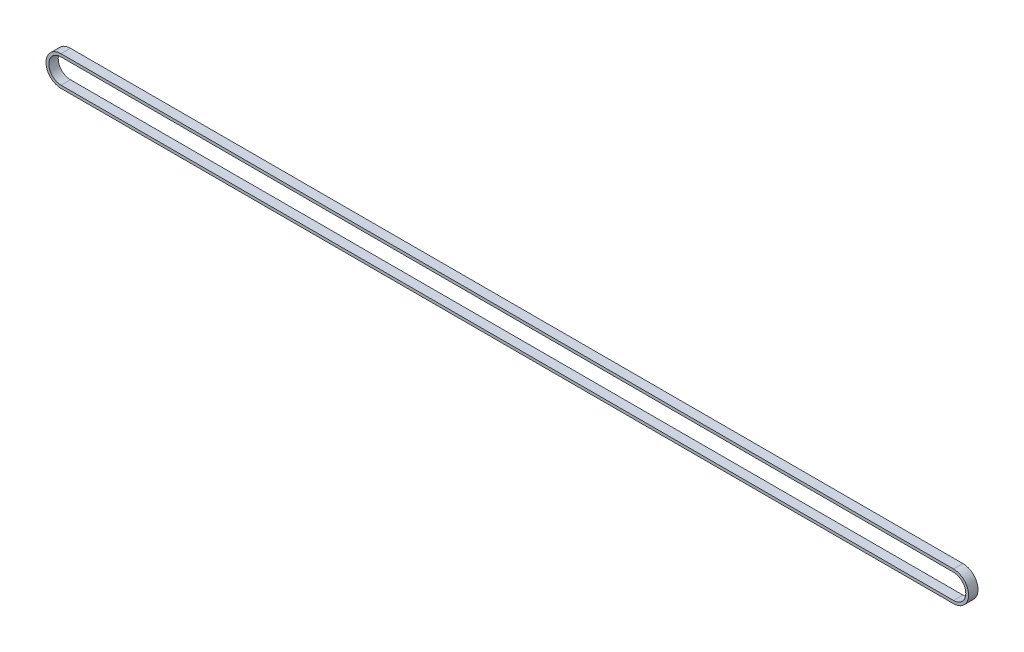
ISO-10303-21;
HEADER;
FILE_DESCRIPTION(('STEP AP214'),'2;1');
FILE_NAME('part.step','',(''),(''),'','','');
FILE_SCHEMA(('AUTOMOTIVE_DESIGN { 1 0 10303 214 1 1 1 1 }'));
ENDSEC;
DATA;
#1=APPLICATION_CONTEXT('core data for automotive mechanical design processes');
#2=APPLICATION_PROTOCOL_DEFINITION('international standard','automotive_design',2000,#1);
#3=PRODUCT_CONTEXT('',#1,'mechanical');
#4=PRODUCT('Part','Part','',(#3));
#5=PRODUCT_RELATED_PRODUCT_CATEGORY('part','',(#4));
#6=PRODUCT_DEFINITION_FORMATION('','',#4);
#7=PRODUCT_DEFINITION_CONTEXT('part definition',#1,'design');
#8=PRODUCT_DEFINITION('design','',#6,#7);
#9=PRODUCT_DEFINITION_SHAPE('','',#8);
#10=(LENGTH_UNIT() NAMED_UNIT(*) SI_UNIT(.MILLI.,.METRE.));
#11=(NAMED_UNIT(*) PLANE_ANGLE_UNIT() SI_UNIT($,.RADIAN.));
#12=(NAMED_UNIT(*) SI_UNIT($,.STERADIAN.) SOLID_ANGLE_UNIT());
#13=UNCERTAINTY_MEASURE_WITH_UNIT(LENGTH_MEASURE(1.E-05),#10,'distance_accuracy_value','');
#14=(GEOMETRIC_REPRESENTATION_CONTEXT(3) GLOBAL_UNCERTAINTY_ASSIGNED_CONTEXT((#13)) GLOBAL_UNIT_ASSIGNED_CONTEXT((#10,
#11,#12)) REPRESENTATION_CONTEXT('',''));
#15=CARTESIAN_POINT('',(0.,0.,0.));
#16=DIRECTION('',(0.,0.,1.));
#17=DIRECTION('',(1.,0.,0.));
#18=AXIS2_PLACEMENT_3D('',#15,#16,#17);
#19=CARTESIAN_POINT('',(0.,0.,5.));
#20=DIRECTION('',(0.,0.,1.));
#21=DIRECTION('',(1.,0.,0.));
#22=AXIS2_PLACEMENT_3D('',#19,#20,#21);
#23=PLANE('',#22);
#24=CARTESIAN_POINT('',(0.,0.,5.));
#25=DIRECTION('',(0.,0.,1.));
#26=DIRECTION('',(1.,0.,0.));
#27=AXIS2_PLACEMENT_3D('',#24,#25,#26);
#28=CIRCLE('',#27,8.);
#29=CARTESIAN_POINT('',(0.,8.,5.));
#30=VERTEX_POINT('',#29);
#31=CARTESIAN_POINT('',(0.,-8.,5.));
#32=VERTEX_POINT('',#31);
#33=EDGE_CURVE('E133',#30,#32,#28,.T.);
#34=ORIENTED_EDGE('',*,*,#33,.T.);
#35=DIRECTION('',(1.,0.,0.));
#36=VECTOR('',#35,1.);
#37=CARTESIAN_POINT('',(0.,-8.,5.));
#38=LINE('',#37,#36);
#39=CARTESIAN_POINT('',(474.5,-8.,5.));
#40=VERTEX_POINT('',#39);
#41=EDGE_CURVE('E136',#32,#40,#38,.T.);
#42=ORIENTED_EDGE('',*,*,#41,.T.);
#43=CARTESIAN_POINT('',(474.5,0.,5.));
#44=DIRECTION('',(0.,0.,1.));
#45=DIRECTION('',(1.,0.,0.));
#46=AXIS2_PLACEMENT_3D('',#43,#44,#45);
#47=CIRCLE('',#46,8.);
#48=CARTESIAN_POINT('',(474.5,8.,5.));
#49=VERTEX_POINT('',#48);
#50=EDGE_CURVE('E139',#40,#49,#47,.T.);
#51=ORIENTED_EDGE('',*,*,#50,.T.);
#52=DIRECTION('',(-1.,0.,0.));
#53=VECTOR('',#52,1.);
#54=CARTESIAN_POINT('',(0.,8.,5.));
#55=LINE('',#54,#53);
#56=EDGE_CURVE('E141',#49,#30,#55,.T.);
#57=ORIENTED_EDGE('',*,*,#56,.T.);
#58=EDGE_LOOP('',(#34,#42,#51,#57));
#59=FACE_BOUND('',#58,.T.);
#60=DIRECTION('',(1.,0.,0.));
#61=VECTOR('',#60,1.);
#62=CARTESIAN_POINT('',(0.,-6.5,5.));
#63=LINE('',#62,#61);
#64=CARTESIAN_POINT('',(0.,-6.5,5.));
#65=VERTEX_POINT('',#64);
#66=CARTESIAN_POINT('',(474.5,-6.5,5.));
#67=VERTEX_POINT('',#66);
#68=EDGE_CURVE('E105',#65,#67,#63,.T.);
#69=ORIENTED_EDGE('',*,*,#68,.F.);
#70=CARTESIAN_POINT('',(0.,0.,5.));
#71=DIRECTION('',(0.,0.,1.));
#72=DIRECTION('',(1.,0.,0.));
#73=AXIS2_PLACEMENT_3D('',#70,#71,#72);
#74=CIRCLE('',#73,6.5);
#75=CARTESIAN_POINT('',(0.,6.5,5.));
#76=VERTEX_POINT('',#75);
#77=EDGE_CURVE('E97',#76,#65,#74,.T.);
#78=ORIENTED_EDGE('',*,*,#77,.F.);
#79=DIRECTION('',(-1.,0.,0.));
#80=VECTOR('',#79,1.);
#81=CARTESIAN_POINT('',(0.,6.5,5.));
#82=LINE('',#81,#80);
#83=CARTESIAN_POINT('',(474.5,6.5,5.));
#84=VERTEX_POINT('',#83);
#85=EDGE_CURVE('E119',#84,#76,#82,.T.);
#86=ORIENTED_EDGE('',*,*,#85,.F.);
#87=CARTESIAN_POINT('',(474.5,0.,5.));
#88=DIRECTION('',(0.,0.,1.));
#89=DIRECTION('',(1.,0.,0.));
#90=AXIS2_PLACEMENT_3D('',#87,#88,#89);
#91=CIRCLE('',#90,6.5);
#92=EDGE_CURVE('E117',#67,#84,#91,.T.);
#93=ORIENTED_EDGE('',*,*,#92,.F.);
#94=EDGE_LOOP('',(#69,#78,#86,#93));
#95=FACE_BOUND('',#94,.T.);
#96=ADVANCED_FACE('F32',(#59,#95),#23,.T.);
#97=CARTESIAN_POINT('',(0.,0.,0.));
#98=DIRECTION('',(0.,0.,1.));
#99=DIRECTION('',(1.,0.,0.));
#100=AXIS2_PLACEMENT_3D('',#97,#98,#99);
#101=PLANE('',#100);
#102=CARTESIAN_POINT('',(0.,0.,0.));
#103=DIRECTION('',(0.,0.,1.));
#104=DIRECTION('',(1.,0.,0.));
#105=AXIS2_PLACEMENT_3D('',#102,#103,#104);
#106=CIRCLE('',#105,8.);
#107=CARTESIAN_POINT('',(0.,8.,0.));
#108=VERTEX_POINT('',#107);
#109=CARTESIAN_POINT('',(0.,-8.,0.));
#110=VERTEX_POINT('',#109);
#111=EDGE_CURVE('E113',#108,#110,#106,.T.);
#112=ORIENTED_EDGE('',*,*,#111,.F.);
#113=DIRECTION('',(-1.,0.,0.));
#114=VECTOR('',#113,1.);
#115=CARTESIAN_POINT('',(0.,8.,0.));
#116=LINE('',#115,#114);
#117=CARTESIAN_POINT('',(474.5,8.,0.));
#118=VERTEX_POINT('',#117);
#119=EDGE_CURVE('E137',#118,#108,#116,.T.);
#120=ORIENTED_EDGE('',*,*,#119,.F.);
#121=CARTESIAN_POINT('',(474.5,0.,0.));
#122=DIRECTION('',(0.,0.,1.));
#123=DIRECTION('',(1.,0.,0.));
#124=AXIS2_PLACEMENT_3D('',#121,#122,#123);
#125=CIRCLE('',#124,8.);
#126=CARTESIAN_POINT('',(474.5,-8.,0.));
#127=VERTEX_POINT('',#126);
#128=EDGE_CURVE('E148',#127,#118,#125,.T.);
#129=ORIENTED_EDGE('',*,*,#128,.F.);
#130=DIRECTION('',(1.,0.,0.));
#131=VECTOR('',#130,1.);
#132=CARTESIAN_POINT('',(0.,-8.,0.));
#133=LINE('',#132,#131);
#134=EDGE_CURVE('E146',#110,#127,#133,.T.);
#135=ORIENTED_EDGE('',*,*,#134,.F.);
#136=EDGE_LOOP('',(#112,#120,#129,#135));
#137=FACE_BOUND('',#136,.T.);
#138=CARTESIAN_POINT('',(0.,0.,0.));
#139=DIRECTION('',(0.,0.,1.));
#140=DIRECTION('',(1.,0.,0.));
#141=AXIS2_PLACEMENT_3D('',#138,#139,#140);
#142=CIRCLE('',#141,6.5);
#143=CARTESIAN_POINT('',(0.,6.5,0.));
#144=VERTEX_POINT('',#143);
#145=CARTESIAN_POINT('',(0.,-6.5,0.));
#146=VERTEX_POINT('',#145);
#147=EDGE_CURVE('E55',#144,#146,#142,.T.);
#148=ORIENTED_EDGE('',*,*,#147,.T.);
#149=DIRECTION('',(1.,0.,0.));
#150=VECTOR('',#149,1.);
#151=CARTESIAN_POINT('',(0.,-6.5,0.));
#152=LINE('',#151,#150);
#153=CARTESIAN_POINT('',(474.5,-6.5,0.));
#154=VERTEX_POINT('',#153);
#155=EDGE_CURVE('E112',#146,#154,#152,.T.);
#156=ORIENTED_EDGE('',*,*,#155,.T.);
#157=CARTESIAN_POINT('',(474.5,0.,0.));
#158=DIRECTION('',(0.,0.,1.));
#159=DIRECTION('',(1.,0.,0.));
#160=AXIS2_PLACEMENT_3D('',#157,#158,#159);
#161=CIRCLE('',#160,6.5);
#162=CARTESIAN_POINT('',(474.5,6.5,0.));
#163=VERTEX_POINT('',#162);
#164=EDGE_CURVE('E125',#154,#163,#161,.T.);
#165=ORIENTED_EDGE('',*,*,#164,.T.);
#166=DIRECTION('',(-1.,0.,0.));
#167=VECTOR('',#166,1.);
#168=CARTESIAN_POINT('',(0.,6.5,0.));
#169=LINE('',#168,#167);
#170=EDGE_CURVE('E106',#163,#144,#169,.T.);
#171=ORIENTED_EDGE('',*,*,#170,.T.);
#172=EDGE_LOOP('',(#148,#156,#165,#171));
#173=FACE_BOUND('',#172,.T.);
#174=ADVANCED_FACE('F166',(#137,#173),#101,.F.);
#175=CARTESIAN_POINT('',(0.,0.,5.));
#176=DIRECTION('',(0.,0.,-1.));
#177=DIRECTION('',(-1.,0.,0.));
#178=AXIS2_PLACEMENT_3D('',#175,#176,#177);
#179=CYLINDRICAL_SURFACE('',#178,8.);
#180=ORIENTED_EDGE('',*,*,#111,.T.);
#181=DIRECTION('',(0.,0.,-1.));
#182=VECTOR('',#181,1.);
#183=CARTESIAN_POINT('',(0.,-8.,5.));
#184=LINE('',#183,#182);
#185=EDGE_CURVE('E11',#32,#110,#184,.T.);
#186=ORIENTED_EDGE('',*,*,#185,.F.);
#187=ORIENTED_EDGE('',*,*,#33,.F.);
#188=DIRECTION('',(0.,0.,-1.));
#189=VECTOR('',#188,1.);
#190=CARTESIAN_POINT('',(0.,8.,5.));
#191=LINE('',#190,#189);
#192=EDGE_CURVE('E143',#30,#108,#191,.T.);
#193=ORIENTED_EDGE('',*,*,#192,.T.);
#194=EDGE_LOOP('',(#180,#186,#187,#193));
#195=FACE_BOUND('',#194,.T.);
#196=ADVANCED_FACE('F34',(#195),#179,.T.);
#197=CARTESIAN_POINT('',(0.,-8.,5.));
#198=DIRECTION('',(0.,1.,0.));
#199=DIRECTION('',(0.,0.,1.));
#200=AXIS2_PLACEMENT_3D('',#197,#198,#199);
#201=PLANE('',#200);
#202=ORIENTED_EDGE('',*,*,#134,.T.);
#203=DIRECTION('',(0.,0.,-1.));
#204=VECTOR('',#203,1.);
#205=CARTESIAN_POINT('',(474.5,-8.,5.));
#206=LINE('',#205,#204);
#207=EDGE_CURVE('E40',#40,#127,#206,.T.);
#208=ORIENTED_EDGE('',*,*,#207,.F.);
#209=ORIENTED_EDGE('',*,*,#41,.F.);
#210=ORIENTED_EDGE('',*,*,#185,.T.);
#211=EDGE_LOOP('',(#202,#208,#209,#210));
#212=FACE_BOUND('',#211,.T.);
#213=ADVANCED_FACE('F176',(#212),#201,.F.);
#214=CARTESIAN_POINT('',(474.5,0.,5.));
#215=DIRECTION('',(0.,0.,-1.));
#216=DIRECTION('',(-1.,0.,0.));
#217=AXIS2_PLACEMENT_3D('',#214,#215,#216);
#218=CYLINDRICAL_SURFACE('',#217,8.);
#219=ORIENTED_EDGE('',*,*,#128,.T.);
#220=DIRECTION('',(0.,0.,-1.));
#221=VECTOR('',#220,1.);
#222=CARTESIAN_POINT('',(474.5,8.,5.));
#223=LINE('',#222,#221);
#224=EDGE_CURVE('E153',#49,#118,#223,.T.);
#225=ORIENTED_EDGE('',*,*,#224,.F.);
#226=ORIENTED_EDGE('',*,*,#50,.F.);
#227=ORIENTED_EDGE('',*,*,#207,.T.);
#228=EDGE_LOOP('',(#219,#225,#226,#227));
#229=FACE_BOUND('',#228,.T.);
#230=ADVANCED_FACE('F160',(#229),#218,.T.);
#231=CARTESIAN_POINT('',(0.,8.,5.));
#232=DIRECTION('',(0.,-1.,0.));
#233=DIRECTION('',(0.,0.,-1.));
#234=AXIS2_PLACEMENT_3D('',#231,#232,#233);
#235=PLANE('',#234);
#236=ORIENTED_EDGE('',*,*,#119,.T.);
#237=ORIENTED_EDGE('',*,*,#192,.F.);
#238=ORIENTED_EDGE('',*,*,#56,.F.);
#239=ORIENTED_EDGE('',*,*,#224,.T.);
#240=EDGE_LOOP('',(#236,#237,#238,#239));
#241=FACE_BOUND('',#240,.T.);
#242=ADVANCED_FACE('F170',(#241),#235,.F.);
#243=CARTESIAN_POINT('',(0.,0.,5.));
#244=DIRECTION('',(0.,0.,-1.));
#245=DIRECTION('',(-1.,0.,0.));
#246=AXIS2_PLACEMENT_3D('',#243,#244,#245);
#247=CYLINDRICAL_SURFACE('',#246,6.5);
#248=ORIENTED_EDGE('',*,*,#147,.F.);
#249=DIRECTION('',(0.,0.,-1.));
#250=VECTOR('',#249,1.);
#251=CARTESIAN_POINT('',(0.,6.5,5.));
#252=LINE('',#251,#250);
#253=EDGE_CURVE('E101',#76,#144,#252,.T.);
#254=ORIENTED_EDGE('',*,*,#253,.F.);
#255=ORIENTED_EDGE('',*,*,#77,.T.);
#256=DIRECTION('',(0.,0.,-1.));
#257=VECTOR('',#256,1.);
#258=CARTESIAN_POINT('',(0.,-6.5,5.));
#259=LINE('',#258,#257);
#260=EDGE_CURVE('E100',#65,#146,#259,.T.);
#261=ORIENTED_EDGE('',*,*,#260,.T.);
#262=EDGE_LOOP('',(#248,#254,#255,#261));
#263=FACE_BOUND('',#262,.T.);
#264=ADVANCED_FACE('F99',(#263),#247,.F.);
#265=CARTESIAN_POINT('',(0.,-6.5,5.));
#266=DIRECTION('',(0.,1.,0.));
#267=DIRECTION('',(0.,0.,1.));
#268=AXIS2_PLACEMENT_3D('',#265,#266,#267);
#269=PLANE('',#268);
#270=ORIENTED_EDGE('',*,*,#155,.F.);
#271=ORIENTED_EDGE('',*,*,#260,.F.);
#272=ORIENTED_EDGE('',*,*,#68,.T.);
#273=DIRECTION('',(0.,0.,-1.));
#274=VECTOR('',#273,1.);
#275=CARTESIAN_POINT('',(474.5,-6.5,5.));
#276=LINE('',#275,#274);
#277=EDGE_CURVE('E114',#67,#154,#276,.T.);
#278=ORIENTED_EDGE('',*,*,#277,.T.);
#279=EDGE_LOOP('',(#270,#271,#272,#278));
#280=FACE_BOUND('',#279,.T.);
#281=ADVANCED_FACE('F109',(#280),#269,.T.);
#282=CARTESIAN_POINT('',(474.5,0.,5.));
#283=DIRECTION('',(0.,0.,-1.));
#284=DIRECTION('',(-1.,0.,0.));
#285=AXIS2_PLACEMENT_3D('',#282,#283,#284);
#286=CYLINDRICAL_SURFACE('',#285,6.5);
#287=ORIENTED_EDGE('',*,*,#164,.F.);
#288=ORIENTED_EDGE('',*,*,#277,.F.);
#289=ORIENTED_EDGE('',*,*,#92,.T.);
#290=DIRECTION('',(0.,0.,-1.));
#291=VECTOR('',#290,1.);
#292=CARTESIAN_POINT('',(474.5,6.5,5.));
#293=LINE('',#292,#291);
#294=EDGE_CURVE('E47',#84,#163,#293,.T.);
#295=ORIENTED_EDGE('',*,*,#294,.T.);
#296=EDGE_LOOP('',(#287,#288,#289,#295));
#297=FACE_BOUND('',#296,.T.);
#298=ADVANCED_FACE('F199',(#297),#286,.F.);
#299=CARTESIAN_POINT('',(0.,6.5,5.));
#300=DIRECTION('',(0.,-1.,0.));
#301=DIRECTION('',(0.,0.,-1.));
#302=AXIS2_PLACEMENT_3D('',#299,#300,#301);
#303=PLANE('',#302);
#304=ORIENTED_EDGE('',*,*,#170,.F.);
#305=ORIENTED_EDGE('',*,*,#294,.F.);
#306=ORIENTED_EDGE('',*,*,#85,.T.);
#307=ORIENTED_EDGE('',*,*,#253,.T.);
#308=EDGE_LOOP('',(#304,#305,#306,#307));
#309=FACE_BOUND('',#308,.T.);
#310=ADVANCED_FACE('F203',(#309),#303,.T.);
#311=CLOSED_SHELL('',(#96,#174,#196,#213,#230,#242,#264,#281,#298,#310));
#312=MANIFOLD_SOLID_BREP('B2',#311);
#313=ADVANCED_BREP_SHAPE_REPRESENTATION('',(#18,#312),#14);
#314=SHAPE_DEFINITION_REPRESENTATION(#9,#313);
ENDSEC;
END-ISO-10303-21;
